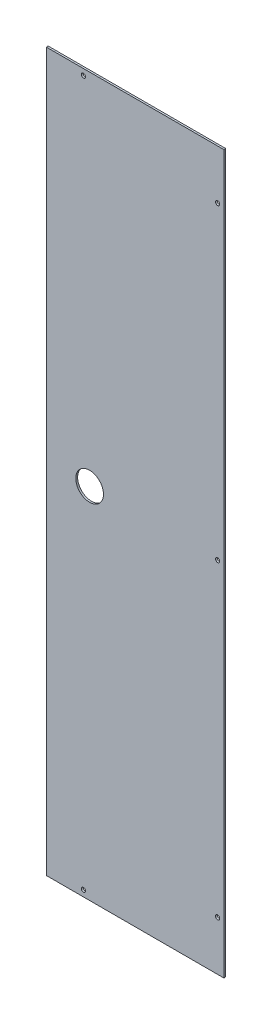
ISO-10303-21;
HEADER;
FILE_DESCRIPTION(('STEP AP214'),'2;1');
FILE_NAME('part.step','',(''),(''),'','','');
FILE_SCHEMA(('AUTOMOTIVE_DESIGN { 1 0 10303 214 1 1 1 1 }'));
ENDSEC;
DATA;
#1=APPLICATION_CONTEXT('core data for automotive mechanical design processes');
#2=APPLICATION_PROTOCOL_DEFINITION('international standard','automotive_design',2000,#1);
#3=PRODUCT_CONTEXT('',#1,'mechanical');
#4=PRODUCT('Part','Part','',(#3));
#5=PRODUCT_RELATED_PRODUCT_CATEGORY('part','',(#4));
#6=PRODUCT_DEFINITION_FORMATION('','',#4);
#7=PRODUCT_DEFINITION_CONTEXT('part definition',#1,'design');
#8=PRODUCT_DEFINITION('design','',#6,#7);
#9=PRODUCT_DEFINITION_SHAPE('','',#8);
#10=(LENGTH_UNIT() NAMED_UNIT(*) SI_UNIT(.MILLI.,.METRE.));
#11=(NAMED_UNIT(*) PLANE_ANGLE_UNIT() SI_UNIT($,.RADIAN.));
#12=(NAMED_UNIT(*) SI_UNIT($,.STERADIAN.) SOLID_ANGLE_UNIT());
#13=UNCERTAINTY_MEASURE_WITH_UNIT(LENGTH_MEASURE(1.E-05),#10,'distance_accuracy_value','');
#14=(GEOMETRIC_REPRESENTATION_CONTEXT(3) GLOBAL_UNCERTAINTY_ASSIGNED_CONTEXT((#13)) GLOBAL_UNIT_ASSIGNED_CONTEXT((#10,
#11,#12)) REPRESENTATION_CONTEXT('',''));
#15=CARTESIAN_POINT('',(0.,0.,0.));
#16=DIRECTION('',(0.,0.,1.));
#17=DIRECTION('',(1.,0.,0.));
#18=AXIS2_PLACEMENT_3D('',#15,#16,#17);
#19=CARTESIAN_POINT('',(-285.,290.,110.));
#20=DIRECTION('',(-1.,0.,0.));
#21=DIRECTION('',(0.,0.,1.));
#22=AXIS2_PLACEMENT_3D('',#19,#20,#21);
#23=PLANE('',#22);
#24=DIRECTION('',(0.,-1.,0.));
#25=VECTOR('',#24,1.);
#26=CARTESIAN_POINT('',(-285.,290.,111.5));
#27=LINE('',#26,#25);
#28=CARTESIAN_POINT('',(-285.,290.,111.5));
#29=VERTEX_POINT('',#28);
#30=CARTESIAN_POINT('',(-285.,-290.,111.5));
#31=VERTEX_POINT('',#30);
#32=EDGE_CURVE('E106',#29,#31,#27,.T.);
#33=ORIENTED_EDGE('',*,*,#32,.F.);
#34=DIRECTION('',(0.,0.,1.));
#35=VECTOR('',#34,1.);
#36=CARTESIAN_POINT('',(-285.,290.,110.));
#37=LINE('',#36,#35);
#38=CARTESIAN_POINT('',(-285.,290.,110.));
#39=VERTEX_POINT('',#38);
#40=EDGE_CURVE('E11',#39,#29,#37,.T.);
#41=ORIENTED_EDGE('',*,*,#40,.F.);
#42=DIRECTION('',(0.,-1.,0.));
#43=VECTOR('',#42,1.);
#44=CARTESIAN_POINT('',(-285.,290.,110.));
#45=LINE('',#44,#43);
#46=CARTESIAN_POINT('',(-285.,-290.,110.));
#47=VERTEX_POINT('',#46);
#48=EDGE_CURVE('E97',#39,#47,#45,.T.);
#49=ORIENTED_EDGE('',*,*,#48,.T.);
#50=DIRECTION('',(0.,0.,1.));
#51=VECTOR('',#50,1.);
#52=CARTESIAN_POINT('',(-285.,-290.,110.));
#53=LINE('',#52,#51);
#54=EDGE_CURVE('E42',#47,#31,#53,.T.);
#55=ORIENTED_EDGE('',*,*,#54,.T.);
#56=EDGE_LOOP('',(#33,#41,#49,#55));
#57=FACE_BOUND('',#56,.T.);
#58=ADVANCED_FACE('F41',(#57),#23,.T.);
#59=CARTESIAN_POINT('',(-285.,290.,110.));
#60=DIRECTION('',(0.,1.,0.));
#61=DIRECTION('',(0.,0.,1.));
#62=AXIS2_PLACEMENT_3D('',#59,#60,#61);
#63=PLANE('',#62);
#64=DIRECTION('',(-1.,0.,0.));
#65=VECTOR('',#64,1.);
#66=CARTESIAN_POINT('',(-285.,290.,111.5));
#67=LINE('',#66,#65);
#68=CARTESIAN_POINT('',(-141.5,290.,111.5));
#69=VERTEX_POINT('',#68);
#70=EDGE_CURVE('E101',#69,#29,#67,.T.);
#71=ORIENTED_EDGE('',*,*,#70,.F.);
#72=DIRECTION('',(0.,0.,1.));
#73=VECTOR('',#72,1.);
#74=CARTESIAN_POINT('',(-141.5,290.,110.));
#75=LINE('',#74,#73);
#76=CARTESIAN_POINT('',(-141.5,290.,110.));
#77=VERTEX_POINT('',#76);
#78=EDGE_CURVE('E49',#77,#69,#75,.T.);
#79=ORIENTED_EDGE('',*,*,#78,.F.);
#80=DIRECTION('',(-1.,0.,0.));
#81=VECTOR('',#80,1.);
#82=CARTESIAN_POINT('',(-285.,290.,110.));
#83=LINE('',#82,#81);
#84=EDGE_CURVE('E96',#77,#39,#83,.T.);
#85=ORIENTED_EDGE('',*,*,#84,.T.);
#86=ORIENTED_EDGE('',*,*,#40,.T.);
#87=EDGE_LOOP('',(#71,#79,#85,#86));
#88=FACE_BOUND('',#87,.T.);
#89=ADVANCED_FACE('F120',(#88),#63,.T.);
#90=CARTESIAN_POINT('',(-141.5,290.,110.));
#91=DIRECTION('',(1.,0.,0.));
#92=DIRECTION('',(0.,0.,-1.));
#93=AXIS2_PLACEMENT_3D('',#90,#91,#92);
#94=PLANE('',#93);
#95=DIRECTION('',(0.,1.,0.));
#96=VECTOR('',#95,1.);
#97=CARTESIAN_POINT('',(-141.5,290.,111.5));
#98=LINE('',#97,#96);
#99=CARTESIAN_POINT('',(-141.5,-290.,111.5));
#100=VERTEX_POINT('',#99);
#101=EDGE_CURVE('E93',#100,#69,#98,.T.);
#102=ORIENTED_EDGE('',*,*,#101,.F.);
#103=DIRECTION('',(0.,0.,1.));
#104=VECTOR('',#103,1.);
#105=CARTESIAN_POINT('',(-141.5,-290.,110.));
#106=LINE('',#105,#104);
#107=CARTESIAN_POINT('',(-141.5,-290.,110.));
#108=VERTEX_POINT('',#107);
#109=EDGE_CURVE('E88',#108,#100,#106,.T.);
#110=ORIENTED_EDGE('',*,*,#109,.F.);
#111=DIRECTION('',(0.,1.,0.));
#112=VECTOR('',#111,1.);
#113=CARTESIAN_POINT('',(-141.5,290.,110.));
#114=LINE('',#113,#112);
#115=EDGE_CURVE('E90',#108,#77,#114,.T.);
#116=ORIENTED_EDGE('',*,*,#115,.T.);
#117=ORIENTED_EDGE('',*,*,#78,.T.);
#118=EDGE_LOOP('',(#102,#110,#116,#117));
#119=FACE_BOUND('',#118,.T.);
#120=ADVANCED_FACE('F86',(#119),#94,.T.);
#121=CARTESIAN_POINT('',(-285.,-290.,110.));
#122=DIRECTION('',(0.,-1.,0.));
#123=DIRECTION('',(0.,0.,-1.));
#124=AXIS2_PLACEMENT_3D('',#121,#122,#123);
#125=PLANE('',#124);
#126=DIRECTION('',(1.,0.,0.));
#127=VECTOR('',#126,1.);
#128=CARTESIAN_POINT('',(-285.,-290.,111.5));
#129=LINE('',#128,#127);
#130=EDGE_CURVE('E108',#31,#100,#129,.T.);
#131=ORIENTED_EDGE('',*,*,#130,.F.);
#132=ORIENTED_EDGE('',*,*,#54,.F.);
#133=DIRECTION('',(1.,0.,0.));
#134=VECTOR('',#133,1.);
#135=CARTESIAN_POINT('',(-285.,-290.,110.));
#136=LINE('',#135,#134);
#137=EDGE_CURVE('E92',#47,#108,#136,.T.);
#138=ORIENTED_EDGE('',*,*,#137,.T.);
#139=ORIENTED_EDGE('',*,*,#109,.T.);
#140=EDGE_LOOP('',(#131,#132,#138,#139));
#141=FACE_BOUND('',#140,.T.);
#142=ADVANCED_FACE('F98',(#141),#125,.T.);
#143=CARTESIAN_POINT('',(0.,0.,110.));
#144=DIRECTION('',(0.,0.,1.));
#145=DIRECTION('',(1.,0.,0.));
#146=AXIS2_PLACEMENT_3D('',#143,#144,#145);
#147=PLANE('',#146);
#148=CARTESIAN_POINT('',(-146.5,250.,110.));
#149=DIRECTION('',(0.,0.,1.));
#150=DIRECTION('',(1.,0.,0.));
#151=AXIS2_PLACEMENT_3D('',#148,#149,#150);
#152=CIRCLE('',#151,1.70000000000001);
#153=CARTESIAN_POINT('',(-144.8,250.,110.));
#154=VERTEX_POINT('',#153);
#155=EDGE_CURVE('E167',#154,#154,#152,.T.);
#156=ORIENTED_EDGE('',*,*,#155,.T.);
#157=EDGE_LOOP('',(#156));
#158=FACE_BOUND('',#157,.T.);
#159=CARTESIAN_POINT('',(-146.5,0.,110.));
#160=DIRECTION('',(0.,0.,1.));
#161=DIRECTION('',(1.,0.,0.));
#162=AXIS2_PLACEMENT_3D('',#159,#160,#161);
#163=CIRCLE('',#162,1.70000000000001);
#164=CARTESIAN_POINT('',(-144.8,0.,110.));
#165=VERTEX_POINT('',#164);
#166=EDGE_CURVE('E171',#165,#165,#163,.T.);
#167=ORIENTED_EDGE('',*,*,#166,.T.);
#168=EDGE_LOOP('',(#167));
#169=FACE_BOUND('',#168,.T.);
#170=CARTESIAN_POINT('',(-255.,285.,110.));
#171=DIRECTION('',(0.,0.,1.));
#172=DIRECTION('',(1.,0.,0.));
#173=AXIS2_PLACEMENT_3D('',#170,#171,#172);
#174=CIRCLE('',#173,1.69999999999998);
#175=CARTESIAN_POINT('',(-253.3,285.,110.));
#176=VERTEX_POINT('',#175);
#177=EDGE_CURVE('E178',#176,#176,#174,.T.);
#178=ORIENTED_EDGE('',*,*,#177,.T.);
#179=EDGE_LOOP('',(#178));
#180=FACE_BOUND('',#179,.T.);
#181=CARTESIAN_POINT('',(-250.,0.,110.));
#182=DIRECTION('',(0.,0.,1.));
#183=DIRECTION('',(1.,0.,0.));
#184=AXIS2_PLACEMENT_3D('',#181,#182,#183);
#185=CIRCLE('',#184,11.2);
#186=CARTESIAN_POINT('',(-238.8,0.,110.));
#187=VERTEX_POINT('',#186);
#188=EDGE_CURVE('E187',#187,#187,#185,.T.);
#189=ORIENTED_EDGE('',*,*,#188,.T.);
#190=EDGE_LOOP('',(#189));
#191=FACE_BOUND('',#190,.T.);
#192=CARTESIAN_POINT('',(-146.5,-250.,110.));
#193=DIRECTION('',(0.,0.,1.));
#194=DIRECTION('',(1.,0.,0.));
#195=AXIS2_PLACEMENT_3D('',#192,#193,#194);
#196=CIRCLE('',#195,1.70000000000001);
#197=CARTESIAN_POINT('',(-144.8,-250.,110.));
#198=VERTEX_POINT('',#197);
#199=EDGE_CURVE('E195',#198,#198,#196,.T.);
#200=ORIENTED_EDGE('',*,*,#199,.T.);
#201=EDGE_LOOP('',(#200));
#202=FACE_BOUND('',#201,.T.);
#203=CARTESIAN_POINT('',(-255.,-285.,110.));
#204=DIRECTION('',(0.,0.,1.));
#205=DIRECTION('',(1.,0.,0.));
#206=AXIS2_PLACEMENT_3D('',#203,#204,#205);
#207=CIRCLE('',#206,1.69999999999998);
#208=CARTESIAN_POINT('',(-253.3,-285.,110.));
#209=VERTEX_POINT('',#208);
#210=EDGE_CURVE('E109',#209,#209,#207,.T.);
#211=ORIENTED_EDGE('',*,*,#210,.T.);
#212=EDGE_LOOP('',(#211));
#213=FACE_BOUND('',#212,.T.);
#214=ORIENTED_EDGE('',*,*,#48,.F.);
#215=ORIENTED_EDGE('',*,*,#84,.F.);
#216=ORIENTED_EDGE('',*,*,#115,.F.);
#217=ORIENTED_EDGE('',*,*,#137,.F.);
#218=EDGE_LOOP('',(#214,#215,#216,#217));
#219=FACE_BOUND('',#218,.T.);
#220=ADVANCED_FACE('F94',(#158,#169,#180,#191,#202,#213,#219),#147,.F.);
#221=CARTESIAN_POINT('',(0.,0.,111.5));
#222=DIRECTION('',(0.,0.,1.));
#223=DIRECTION('',(1.,0.,0.));
#224=AXIS2_PLACEMENT_3D('',#221,#222,#223);
#225=PLANE('',#224);
#226=CARTESIAN_POINT('',(-146.5,250.,111.5));
#227=DIRECTION('',(0.,0.,1.));
#228=DIRECTION('',(1.,0.,0.));
#229=AXIS2_PLACEMENT_3D('',#226,#227,#228);
#230=CIRCLE('',#229,1.70000000000001);
#231=CARTESIAN_POINT('',(-144.8,250.,111.5));
#232=VERTEX_POINT('',#231);
#233=EDGE_CURVE('E166',#232,#232,#230,.T.);
#234=ORIENTED_EDGE('',*,*,#233,.F.);
#235=EDGE_LOOP('',(#234));
#236=FACE_BOUND('',#235,.T.);
#237=CARTESIAN_POINT('',(-146.5,0.,111.5));
#238=DIRECTION('',(0.,0.,1.));
#239=DIRECTION('',(1.,0.,0.));
#240=AXIS2_PLACEMENT_3D('',#237,#238,#239);
#241=CIRCLE('',#240,1.70000000000001);
#242=CARTESIAN_POINT('',(-144.8,0.,111.5));
#243=VERTEX_POINT('',#242);
#244=EDGE_CURVE('E172',#243,#243,#241,.T.);
#245=ORIENTED_EDGE('',*,*,#244,.F.);
#246=EDGE_LOOP('',(#245));
#247=FACE_BOUND('',#246,.T.);
#248=CARTESIAN_POINT('',(-255.,285.,111.5));
#249=DIRECTION('',(0.,0.,1.));
#250=DIRECTION('',(1.,0.,0.));
#251=AXIS2_PLACEMENT_3D('',#248,#249,#250);
#252=CIRCLE('',#251,1.69999999999998);
#253=CARTESIAN_POINT('',(-253.3,285.,111.5));
#254=VERTEX_POINT('',#253);
#255=EDGE_CURVE('E180',#254,#254,#252,.T.);
#256=ORIENTED_EDGE('',*,*,#255,.F.);
#257=EDGE_LOOP('',(#256));
#258=FACE_BOUND('',#257,.T.);
#259=CARTESIAN_POINT('',(-250.,0.,111.5));
#260=DIRECTION('',(0.,0.,1.));
#261=DIRECTION('',(1.,0.,0.));
#262=AXIS2_PLACEMENT_3D('',#259,#260,#261);
#263=CIRCLE('',#262,11.2);
#264=CARTESIAN_POINT('',(-238.8,0.,111.5));
#265=VERTEX_POINT('',#264);
#266=EDGE_CURVE('E181',#265,#265,#263,.T.);
#267=ORIENTED_EDGE('',*,*,#266,.F.);
#268=EDGE_LOOP('',(#267));
#269=FACE_BOUND('',#268,.T.);
#270=CARTESIAN_POINT('',(-146.5,-250.,111.5));
#271=DIRECTION('',(0.,0.,1.));
#272=DIRECTION('',(1.,0.,0.));
#273=AXIS2_PLACEMENT_3D('',#270,#271,#272);
#274=CIRCLE('',#273,1.70000000000001);
#275=CARTESIAN_POINT('',(-144.8,-250.,111.5));
#276=VERTEX_POINT('',#275);
#277=EDGE_CURVE('E186',#276,#276,#274,.T.);
#278=ORIENTED_EDGE('',*,*,#277,.F.);
#279=EDGE_LOOP('',(#278));
#280=FACE_BOUND('',#279,.T.);
#281=CARTESIAN_POINT('',(-255.,-285.,111.5));
#282=DIRECTION('',(0.,0.,1.));
#283=DIRECTION('',(1.,0.,0.));
#284=AXIS2_PLACEMENT_3D('',#281,#282,#283);
#285=CIRCLE('',#284,1.69999999999998);
#286=CARTESIAN_POINT('',(-253.3,-285.,111.5));
#287=VERTEX_POINT('',#286);
#288=EDGE_CURVE('E193',#287,#287,#285,.T.);
#289=ORIENTED_EDGE('',*,*,#288,.F.);
#290=EDGE_LOOP('',(#289));
#291=FACE_BOUND('',#290,.T.);
#292=ORIENTED_EDGE('',*,*,#32,.T.);
#293=ORIENTED_EDGE('',*,*,#130,.T.);
#294=ORIENTED_EDGE('',*,*,#101,.T.);
#295=ORIENTED_EDGE('',*,*,#70,.T.);
#296=EDGE_LOOP('',(#292,#293,#294,#295));
#297=FACE_BOUND('',#296,.T.);
#298=ADVANCED_FACE('F117',(#236,#247,#258,#269,#280,#291,#297),#225,.T.);
#299=CARTESIAN_POINT('',(-255.,-285.,110.));
#300=DIRECTION('',(0.,0.,1.));
#301=DIRECTION('',(1.,0.,0.));
#302=AXIS2_PLACEMENT_3D('',#299,#300,#301);
#303=CYLINDRICAL_SURFACE('',#302,1.69999999999998);
#304=ORIENTED_EDGE('',*,*,#210,.F.);
#305=EDGE_LOOP('',(#304));
#306=FACE_BOUND('',#305,.T.);
#307=ORIENTED_EDGE('',*,*,#288,.T.);
#308=EDGE_LOOP('',(#307));
#309=FACE_BOUND('',#308,.T.);
#310=ADVANCED_FACE('F133',(#306,#309),#303,.F.);
#311=CARTESIAN_POINT('',(-146.5,-250.,110.));
#312=DIRECTION('',(0.,0.,1.));
#313=DIRECTION('',(1.,0.,0.));
#314=AXIS2_PLACEMENT_3D('',#311,#312,#313);
#315=CYLINDRICAL_SURFACE('',#314,1.70000000000001);
#316=ORIENTED_EDGE('',*,*,#199,.F.);
#317=EDGE_LOOP('',(#316));
#318=FACE_BOUND('',#317,.T.);
#319=ORIENTED_EDGE('',*,*,#277,.T.);
#320=EDGE_LOOP('',(#319));
#321=FACE_BOUND('',#320,.T.);
#322=ADVANCED_FACE('F142',(#318,#321),#315,.F.);
#323=CARTESIAN_POINT('',(-250.,0.,110.));
#324=DIRECTION('',(0.,0.,1.));
#325=DIRECTION('',(1.,0.,0.));
#326=AXIS2_PLACEMENT_3D('',#323,#324,#325);
#327=CYLINDRICAL_SURFACE('',#326,11.2);
#328=ORIENTED_EDGE('',*,*,#188,.F.);
#329=EDGE_LOOP('',(#328));
#330=FACE_BOUND('',#329,.T.);
#331=ORIENTED_EDGE('',*,*,#266,.T.);
#332=EDGE_LOOP('',(#331));
#333=FACE_BOUND('',#332,.T.);
#334=ADVANCED_FACE('F148',(#330,#333),#327,.F.);
#335=CARTESIAN_POINT('',(-255.,285.,110.));
#336=DIRECTION('',(0.,0.,1.));
#337=DIRECTION('',(1.,0.,0.));
#338=AXIS2_PLACEMENT_3D('',#335,#336,#337);
#339=CYLINDRICAL_SURFACE('',#338,1.69999999999998);
#340=ORIENTED_EDGE('',*,*,#177,.F.);
#341=EDGE_LOOP('',(#340));
#342=FACE_BOUND('',#341,.T.);
#343=ORIENTED_EDGE('',*,*,#255,.T.);
#344=EDGE_LOOP('',(#343));
#345=FACE_BOUND('',#344,.T.);
#346=ADVANCED_FACE('F147',(#342,#345),#339,.F.);
#347=CARTESIAN_POINT('',(-146.5,0.,110.));
#348=DIRECTION('',(0.,0.,1.));
#349=DIRECTION('',(1.,0.,0.));
#350=AXIS2_PLACEMENT_3D('',#347,#348,#349);
#351=CYLINDRICAL_SURFACE('',#350,1.70000000000001);
#352=ORIENTED_EDGE('',*,*,#166,.F.);
#353=EDGE_LOOP('',(#352));
#354=FACE_BOUND('',#353,.T.);
#355=ORIENTED_EDGE('',*,*,#244,.T.);
#356=EDGE_LOOP('',(#355));
#357=FACE_BOUND('',#356,.T.);
#358=ADVANCED_FACE('F152',(#354,#357),#351,.F.);
#359=CARTESIAN_POINT('',(-146.5,250.,110.));
#360=DIRECTION('',(0.,0.,1.));
#361=DIRECTION('',(1.,0.,0.));
#362=AXIS2_PLACEMENT_3D('',#359,#360,#361);
#363=CYLINDRICAL_SURFACE('',#362,1.70000000000001);
#364=ORIENTED_EDGE('',*,*,#155,.F.);
#365=EDGE_LOOP('',(#364));
#366=FACE_BOUND('',#365,.T.);
#367=ORIENTED_EDGE('',*,*,#233,.T.);
#368=EDGE_LOOP('',(#367));
#369=FACE_BOUND('',#368,.T.);
#370=ADVANCED_FACE('F158',(#366,#369),#363,.F.);
#371=CLOSED_SHELL('',(#58,#89,#120,#142,#220,#298,#310,#322,#334,#346,#358,#370));
#372=MANIFOLD_SOLID_BREP('B2',#371);
#373=ADVANCED_BREP_SHAPE_REPRESENTATION('',(#18,#372),#14);
#374=SHAPE_DEFINITION_REPRESENTATION(#9,#373);
ENDSEC;
END-ISO-10303-21;
